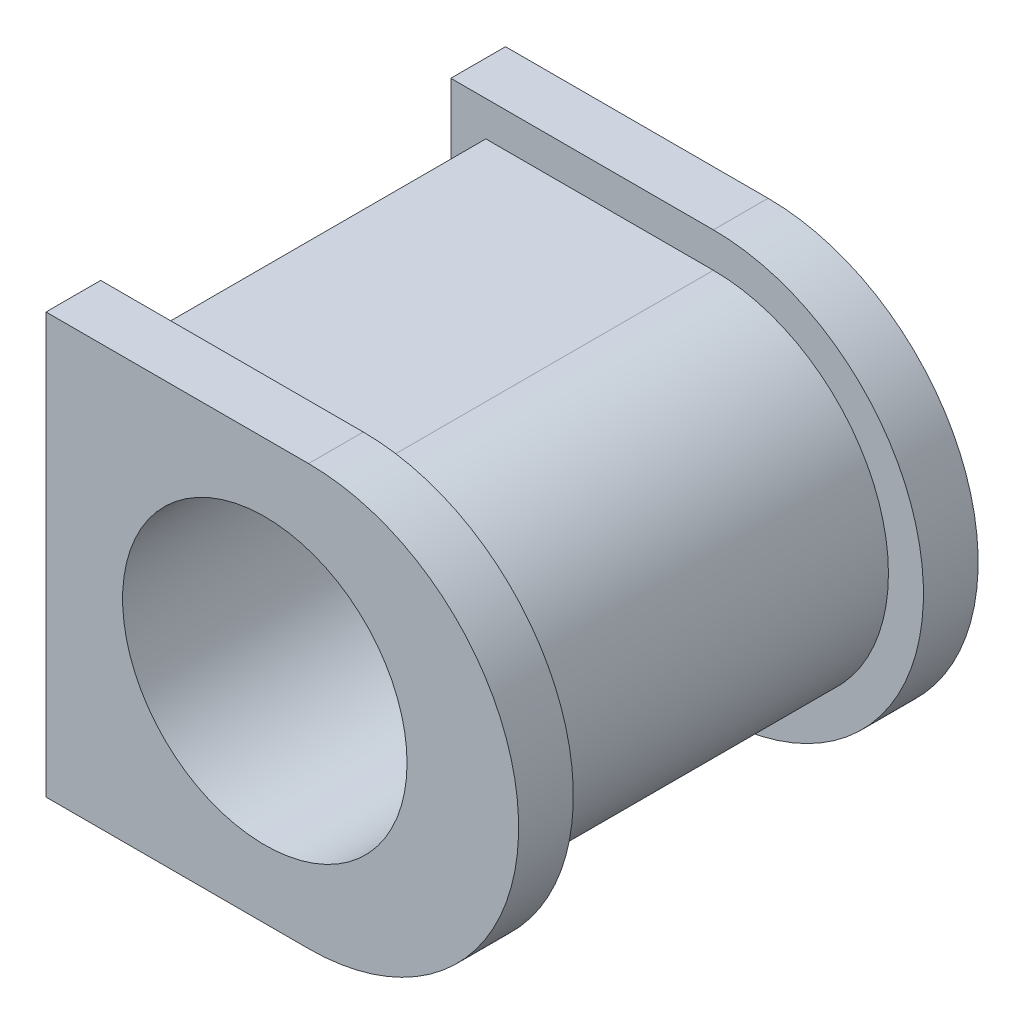
ISO-10303-21;
HEADER;
FILE_DESCRIPTION(('STEP AP214'),'2;1');
FILE_NAME('part.step','',(''),(''),'','','');
FILE_SCHEMA(('AUTOMOTIVE_DESIGN { 1 0 10303 214 1 1 1 1 }'));
ENDSEC;
DATA;
#1=APPLICATION_CONTEXT('core data for automotive mechanical design processes');
#2=APPLICATION_PROTOCOL_DEFINITION('international standard','automotive_design',2000,#1);
#3=PRODUCT_CONTEXT('',#1,'mechanical');
#4=PRODUCT('Part','Part','',(#3));
#5=PRODUCT_RELATED_PRODUCT_CATEGORY('part','',(#4));
#6=PRODUCT_DEFINITION_FORMATION('','',#4);
#7=PRODUCT_DEFINITION_CONTEXT('part definition',#1,'design');
#8=PRODUCT_DEFINITION('design','',#6,#7);
#9=PRODUCT_DEFINITION_SHAPE('','',#8);
#10=(LENGTH_UNIT() NAMED_UNIT(*) SI_UNIT(.MILLI.,.METRE.));
#11=(NAMED_UNIT(*) PLANE_ANGLE_UNIT() SI_UNIT($,.RADIAN.));
#12=(NAMED_UNIT(*) SI_UNIT($,.STERADIAN.) SOLID_ANGLE_UNIT());
#13=UNCERTAINTY_MEASURE_WITH_UNIT(LENGTH_MEASURE(1.E-05),#10,'distance_accuracy_value','');
#14=(GEOMETRIC_REPRESENTATION_CONTEXT(3) GLOBAL_UNCERTAINTY_ASSIGNED_CONTEXT((#13)) GLOBAL_UNIT_ASSIGNED_CONTEXT((#10,
#11,#12)) REPRESENTATION_CONTEXT('',''));
#15=CARTESIAN_POINT('',(0.,0.,0.));
#16=DIRECTION('',(0.,0.,1.));
#17=DIRECTION('',(1.,0.,0.));
#18=AXIS2_PLACEMENT_3D('',#15,#16,#17);
#19=CARTESIAN_POINT('',(26.,0.,40.));
#20=DIRECTION('',(0.,0.,-1.));
#21=DIRECTION('',(-1.,0.,0.));
#22=AXIS2_PLACEMENT_3D('',#19,#20,#21);
#23=CYLINDRICAL_SURFACE('',#22,40.);
#24=CARTESIAN_POINT('',(26.,0.,-40.));
#25=DIRECTION('',(0.,0.,1.));
#26=DIRECTION('',(1.,0.,0.));
#27=AXIS2_PLACEMENT_3D('',#24,#25,#26);
#28=CIRCLE('',#27,40.);
#29=CARTESIAN_POINT('',(26.,-40.,-40.));
#30=VERTEX_POINT('',#29);
#31=CARTESIAN_POINT('',(26.,40.,-40.));
#32=VERTEX_POINT('',#31);
#33=EDGE_CURVE('E199',#30,#32,#28,.T.);
#34=ORIENTED_EDGE('',*,*,#33,.T.);
#35=DIRECTION('',(0.,0.,-1.));
#36=VECTOR('',#35,1.);
#37=CARTESIAN_POINT('',(26.,40.,40.));
#38=LINE('',#37,#36);
#39=CARTESIAN_POINT('',(26.,40.,40.));
#40=VERTEX_POINT('',#39);
#41=EDGE_CURVE('E11',#40,#32,#38,.T.);
#42=ORIENTED_EDGE('',*,*,#41,.F.);
#43=CARTESIAN_POINT('',(26.,0.,40.));
#44=DIRECTION('',(0.,0.,1.));
#45=DIRECTION('',(1.,0.,0.));
#46=AXIS2_PLACEMENT_3D('',#43,#44,#45);
#47=CIRCLE('',#46,40.);
#48=CARTESIAN_POINT('',(26.,-40.,40.));
#49=VERTEX_POINT('',#48);
#50=EDGE_CURVE('E200',#49,#40,#47,.T.);
#51=ORIENTED_EDGE('',*,*,#50,.F.);
#52=DIRECTION('',(0.,0.,-1.));
#53=VECTOR('',#52,1.);
#54=CARTESIAN_POINT('',(26.,-40.,40.));
#55=LINE('',#54,#53);
#56=EDGE_CURVE('E213',#49,#30,#55,.T.);
#57=ORIENTED_EDGE('',*,*,#56,.T.);
#58=EDGE_LOOP('',(#34,#42,#51,#57));
#59=FACE_BOUND('',#58,.T.);
#60=ADVANCED_FACE('F37',(#59),#23,.T.);
#61=CARTESIAN_POINT('',(-26.,40.,40.));
#62=DIRECTION('',(0.,-1.,0.));
#63=DIRECTION('',(0.,0.,-1.));
#64=AXIS2_PLACEMENT_3D('',#61,#62,#63);
#65=PLANE('',#64);
#66=DIRECTION('',(-1.,0.,0.));
#67=VECTOR('',#66,1.);
#68=CARTESIAN_POINT('',(-26.,40.,-40.));
#69=LINE('',#68,#67);
#70=CARTESIAN_POINT('',(-26.,40.,-40.));
#71=VERTEX_POINT('',#70);
#72=EDGE_CURVE('E216',#32,#71,#69,.T.);
#73=ORIENTED_EDGE('',*,*,#72,.T.);
#74=DIRECTION('',(0.,0.,-1.));
#75=VECTOR('',#74,1.);
#76=CARTESIAN_POINT('',(-26.,40.,40.));
#77=LINE('',#76,#75);
#78=CARTESIAN_POINT('',(-26.,40.,40.));
#79=VERTEX_POINT('',#78);
#80=EDGE_CURVE('E45',#79,#71,#77,.T.);
#81=ORIENTED_EDGE('',*,*,#80,.F.);
#82=DIRECTION('',(-1.,0.,0.));
#83=VECTOR('',#82,1.);
#84=CARTESIAN_POINT('',(-26.,40.,40.));
#85=LINE('',#84,#83);
#86=EDGE_CURVE('E203',#40,#79,#85,.T.);
#87=ORIENTED_EDGE('',*,*,#86,.F.);
#88=ORIENTED_EDGE('',*,*,#41,.T.);
#89=EDGE_LOOP('',(#73,#81,#87,#88));
#90=FACE_BOUND('',#89,.T.);
#91=ADVANCED_FACE('F229',(#90),#65,.F.);
#92=CARTESIAN_POINT('',(-26.,-40.,40.));
#93=DIRECTION('',(1.,0.,0.));
#94=DIRECTION('',(0.,0.,-1.));
#95=AXIS2_PLACEMENT_3D('',#92,#93,#94);
#96=PLANE('',#95);
#97=DIRECTION('',(0.,-1.,0.));
#98=VECTOR('',#97,1.);
#99=CARTESIAN_POINT('',(-26.,-40.,-40.));
#100=LINE('',#99,#98);
#101=CARTESIAN_POINT('',(-26.,-40.,-40.));
#102=VERTEX_POINT('',#101);
#103=EDGE_CURVE('E219',#71,#102,#100,.T.);
#104=ORIENTED_EDGE('',*,*,#103,.T.);
#105=DIRECTION('',(0.,0.,-1.));
#106=VECTOR('',#105,1.);
#107=CARTESIAN_POINT('',(-26.,-40.,40.));
#108=LINE('',#107,#106);
#109=CARTESIAN_POINT('',(-26.,-40.,40.));
#110=VERTEX_POINT('',#109);
#111=EDGE_CURVE('E52',#110,#102,#108,.T.);
#112=ORIENTED_EDGE('',*,*,#111,.F.);
#113=DIRECTION('',(0.,-1.,0.));
#114=VECTOR('',#113,1.);
#115=CARTESIAN_POINT('',(-26.,-40.,40.));
#116=LINE('',#115,#114);
#117=EDGE_CURVE('E207',#79,#110,#116,.T.);
#118=ORIENTED_EDGE('',*,*,#117,.F.);
#119=ORIENTED_EDGE('',*,*,#80,.T.);
#120=EDGE_LOOP('',(#104,#112,#118,#119));
#121=FACE_BOUND('',#120,.T.);
#122=ADVANCED_FACE('F226',(#121),#96,.F.);
#123=CARTESIAN_POINT('',(-26.,-40.,40.));
#124=DIRECTION('',(0.,1.,0.));
#125=DIRECTION('',(0.,0.,1.));
#126=AXIS2_PLACEMENT_3D('',#123,#124,#125);
#127=PLANE('',#126);
#128=DIRECTION('',(1.,0.,0.));
#129=VECTOR('',#128,1.);
#130=CARTESIAN_POINT('',(-26.,-40.,-40.));
#131=LINE('',#130,#129);
#132=EDGE_CURVE('E204',#102,#30,#131,.T.);
#133=ORIENTED_EDGE('',*,*,#132,.T.);
#134=ORIENTED_EDGE('',*,*,#56,.F.);
#135=DIRECTION('',(1.,0.,0.));
#136=VECTOR('',#135,1.);
#137=CARTESIAN_POINT('',(-26.,-40.,40.));
#138=LINE('',#137,#136);
#139=EDGE_CURVE('E210',#110,#49,#138,.T.);
#140=ORIENTED_EDGE('',*,*,#139,.F.);
#141=ORIENTED_EDGE('',*,*,#111,.T.);
#142=EDGE_LOOP('',(#133,#134,#140,#141));
#143=FACE_BOUND('',#142,.T.);
#144=ADVANCED_FACE('F236',(#143),#127,.F.);
#145=CARTESIAN_POINT('',(16.,0.,40.));
#146=DIRECTION('',(0.,0.,-1.));
#147=DIRECTION('',(-1.,0.,0.));
#148=AXIS2_PLACEMENT_3D('',#145,#146,#147);
#149=CYLINDRICAL_SURFACE('',#148,32.5);
#150=CARTESIAN_POINT('',(16.,0.,52.5));
#151=DIRECTION('',(0.,0.,1.));
#152=DIRECTION('',(1.,0.,0.));
#153=AXIS2_PLACEMENT_3D('',#150,#151,#152);
#154=CIRCLE('',#153,32.5);
#155=CARTESIAN_POINT('',(48.5,0.,52.5));
#156=VERTEX_POINT('',#155);
#157=EDGE_CURVE('E133',#156,#156,#154,.T.);
#158=ORIENTED_EDGE('',*,*,#157,.T.);
#159=EDGE_LOOP('',(#158));
#160=FACE_BOUND('',#159,.T.);
#161=CARTESIAN_POINT('',(16.,0.,-52.5));
#162=DIRECTION('',(0.,0.,1.));
#163=DIRECTION('',(1.,0.,0.));
#164=AXIS2_PLACEMENT_3D('',#161,#162,#163);
#165=CIRCLE('',#164,32.5);
#166=CARTESIAN_POINT('',(48.5,0.,-52.5));
#167=VERTEX_POINT('',#166);
#168=EDGE_CURVE('E156',#167,#167,#165,.T.);
#169=ORIENTED_EDGE('',*,*,#168,.F.);
#170=EDGE_LOOP('',(#169));
#171=FACE_BOUND('',#170,.T.);
#172=ADVANCED_FACE('F242',(#160,#171),#149,.F.);
#173=CARTESIAN_POINT('',(26.,0.,40.));
#174=DIRECTION('',(0.,0.,1.));
#175=DIRECTION('',(1.,0.,0.));
#176=AXIS2_PLACEMENT_3D('',#173,#174,#175);
#177=PLANE('',#176);
#178=CARTESIAN_POINT('',(26.,0.,40.));
#179=DIRECTION('',(0.,0.,1.));
#180=DIRECTION('',(1.,0.,0.));
#181=AXIS2_PLACEMENT_3D('',#178,#179,#180);
#182=CIRCLE('',#181,48.);
#183=CARTESIAN_POINT('',(26.,-48.,40.));
#184=VERTEX_POINT('',#183);
#185=CARTESIAN_POINT('',(26.,48.,40.));
#186=VERTEX_POINT('',#185);
#187=EDGE_CURVE('E169',#184,#186,#182,.T.);
#188=ORIENTED_EDGE('',*,*,#187,.F.);
#189=DIRECTION('',(1.,0.,0.));
#190=VECTOR('',#189,1.);
#191=CARTESIAN_POINT('',(-34.,-48.,40.));
#192=LINE('',#191,#190);
#193=CARTESIAN_POINT('',(-34.,-48.,40.));
#194=VERTEX_POINT('',#193);
#195=EDGE_CURVE('E174',#194,#184,#192,.T.);
#196=ORIENTED_EDGE('',*,*,#195,.F.);
#197=DIRECTION('',(0.,-1.,0.));
#198=VECTOR('',#197,1.);
#199=CARTESIAN_POINT('',(-34.,48.,40.));
#200=LINE('',#199,#198);
#201=CARTESIAN_POINT('',(-34.,48.,40.));
#202=VERTEX_POINT('',#201);
#203=EDGE_CURVE('E185',#202,#194,#200,.T.);
#204=ORIENTED_EDGE('',*,*,#203,.F.);
#205=DIRECTION('',(-1.,0.,0.));
#206=VECTOR('',#205,1.);
#207=CARTESIAN_POINT('',(26.,48.,40.));
#208=LINE('',#207,#206);
#209=EDGE_CURVE('E183',#186,#202,#208,.T.);
#210=ORIENTED_EDGE('',*,*,#209,.F.);
#211=EDGE_LOOP('',(#188,#196,#204,#210));
#212=FACE_BOUND('',#211,.T.);
#213=ORIENTED_EDGE('',*,*,#139,.T.);
#214=ORIENTED_EDGE('',*,*,#50,.T.);
#215=ORIENTED_EDGE('',*,*,#86,.T.);
#216=ORIENTED_EDGE('',*,*,#117,.T.);
#217=EDGE_LOOP('',(#213,#214,#215,#216));
#218=FACE_BOUND('',#217,.T.);
#219=ADVANCED_FACE('F239',(#212,#218),#177,.F.);
#220=CARTESIAN_POINT('',(26.,0.,52.5));
#221=DIRECTION('',(0.,0.,1.));
#222=DIRECTION('',(1.,0.,0.));
#223=AXIS2_PLACEMENT_3D('',#220,#221,#222);
#224=PLANE('',#223);
#225=CARTESIAN_POINT('',(26.,0.,52.5));
#226=DIRECTION('',(0.,0.,1.));
#227=DIRECTION('',(1.,0.,0.));
#228=AXIS2_PLACEMENT_3D('',#225,#226,#227);
#229=CIRCLE('',#228,48.);
#230=CARTESIAN_POINT('',(26.,-48.,52.5));
#231=VERTEX_POINT('',#230);
#232=CARTESIAN_POINT('',(26.,48.,52.5));
#233=VERTEX_POINT('',#232);
#234=EDGE_CURVE('E170',#231,#233,#229,.T.);
#235=ORIENTED_EDGE('',*,*,#234,.T.);
#236=DIRECTION('',(-1.,0.,0.));
#237=VECTOR('',#236,1.);
#238=CARTESIAN_POINT('',(26.,48.,52.5));
#239=LINE('',#238,#237);
#240=CARTESIAN_POINT('',(-34.,48.,52.5));
#241=VERTEX_POINT('',#240);
#242=EDGE_CURVE('E173',#233,#241,#239,.T.);
#243=ORIENTED_EDGE('',*,*,#242,.T.);
#244=DIRECTION('',(0.,-1.,0.));
#245=VECTOR('',#244,1.);
#246=CARTESIAN_POINT('',(-34.,48.,52.5));
#247=LINE('',#246,#245);
#248=CARTESIAN_POINT('',(-34.,-48.,52.5));
#249=VERTEX_POINT('',#248);
#250=EDGE_CURVE('E176',#241,#249,#247,.T.);
#251=ORIENTED_EDGE('',*,*,#250,.T.);
#252=DIRECTION('',(1.,0.,0.));
#253=VECTOR('',#252,1.);
#254=CARTESIAN_POINT('',(-34.,-48.,52.5));
#255=LINE('',#254,#253);
#256=EDGE_CURVE('E178',#249,#231,#255,.T.);
#257=ORIENTED_EDGE('',*,*,#256,.T.);
#258=EDGE_LOOP('',(#235,#243,#251,#257));
#259=FACE_BOUND('',#258,.T.);
#260=ORIENTED_EDGE('',*,*,#157,.F.);
#261=EDGE_LOOP('',(#260));
#262=FACE_BOUND('',#261,.T.);
#263=ADVANCED_FACE('F241',(#259,#262),#224,.T.);
#264=CARTESIAN_POINT('',(26.,0.,52.5));
#265=DIRECTION('',(0.,0.,-1.));
#266=DIRECTION('',(-1.,0.,0.));
#267=AXIS2_PLACEMENT_3D('',#264,#265,#266);
#268=CYLINDRICAL_SURFACE('',#267,48.);
#269=ORIENTED_EDGE('',*,*,#187,.T.);
#270=DIRECTION('',(0.,0.,-1.));
#271=VECTOR('',#270,1.);
#272=CARTESIAN_POINT('',(26.,48.,52.5));
#273=LINE('',#272,#271);
#274=EDGE_CURVE('E196',#233,#186,#273,.T.);
#275=ORIENTED_EDGE('',*,*,#274,.F.);
#276=ORIENTED_EDGE('',*,*,#234,.F.);
#277=DIRECTION('',(0.,0.,-1.));
#278=VECTOR('',#277,1.);
#279=CARTESIAN_POINT('',(26.,-48.,52.5));
#280=LINE('',#279,#278);
#281=EDGE_CURVE('E180',#231,#184,#280,.T.);
#282=ORIENTED_EDGE('',*,*,#281,.T.);
#283=EDGE_LOOP('',(#269,#275,#276,#282));
#284=FACE_BOUND('',#283,.T.);
#285=ADVANCED_FACE('F249',(#284),#268,.T.);
#286=CARTESIAN_POINT('',(26.,48.,52.5));
#287=DIRECTION('',(0.,-1.,0.));
#288=DIRECTION('',(1.,0.,0.));
#289=AXIS2_PLACEMENT_3D('',#286,#287,#288);
#290=PLANE('',#289);
#291=ORIENTED_EDGE('',*,*,#209,.T.);
#292=DIRECTION('',(0.,0.,-1.));
#293=VECTOR('',#292,1.);
#294=CARTESIAN_POINT('',(-34.,48.,52.5));
#295=LINE('',#294,#293);
#296=EDGE_CURVE('E193',#241,#202,#295,.T.);
#297=ORIENTED_EDGE('',*,*,#296,.F.);
#298=ORIENTED_EDGE('',*,*,#242,.F.);
#299=ORIENTED_EDGE('',*,*,#274,.T.);
#300=EDGE_LOOP('',(#291,#297,#298,#299));
#301=FACE_BOUND('',#300,.T.);
#302=ADVANCED_FACE('F269',(#301),#290,.F.);
#303=CARTESIAN_POINT('',(-34.,48.,52.5));
#304=DIRECTION('',(1.,0.,0.));
#305=DIRECTION('',(0.,0.,-1.));
#306=AXIS2_PLACEMENT_3D('',#303,#304,#305);
#307=PLANE('',#306);
#308=ORIENTED_EDGE('',*,*,#203,.T.);
#309=DIRECTION('',(0.,0.,-1.));
#310=VECTOR('',#309,1.);
#311=CARTESIAN_POINT('',(-34.,-48.,52.5));
#312=LINE('',#311,#310);
#313=EDGE_CURVE('E190',#249,#194,#312,.T.);
#314=ORIENTED_EDGE('',*,*,#313,.F.);
#315=ORIENTED_EDGE('',*,*,#250,.F.);
#316=ORIENTED_EDGE('',*,*,#296,.T.);
#317=EDGE_LOOP('',(#308,#314,#315,#316));
#318=FACE_BOUND('',#317,.T.);
#319=ADVANCED_FACE('F273',(#318),#307,.F.);
#320=CARTESIAN_POINT('',(-34.,-48.,52.5));
#321=DIRECTION('',(0.,1.,0.));
#322=DIRECTION('',(-1.,0.,0.));
#323=AXIS2_PLACEMENT_3D('',#320,#321,#322);
#324=PLANE('',#323);
#325=ORIENTED_EDGE('',*,*,#195,.T.);
#326=ORIENTED_EDGE('',*,*,#281,.F.);
#327=ORIENTED_EDGE('',*,*,#256,.F.);
#328=ORIENTED_EDGE('',*,*,#313,.T.);
#329=EDGE_LOOP('',(#325,#326,#327,#328));
#330=FACE_BOUND('',#329,.T.);
#331=ADVANCED_FACE('F276',(#330),#324,.F.);
#332=CARTESIAN_POINT('',(26.,0.,-52.5));
#333=DIRECTION('',(0.,0.,1.));
#334=DIRECTION('',(1.,0.,0.));
#335=AXIS2_PLACEMENT_3D('',#332,#333,#334);
#336=CYLINDRICAL_SURFACE('',#335,48.);
#337=CARTESIAN_POINT('',(26.,0.,-40.));
#338=DIRECTION('',(0.,0.,1.));
#339=DIRECTION('',(1.,0.,0.));
#340=AXIS2_PLACEMENT_3D('',#337,#338,#339);
#341=CIRCLE('',#340,48.);
#342=CARTESIAN_POINT('',(26.,-48.,-40.));
#343=VERTEX_POINT('',#342);
#344=CARTESIAN_POINT('',(26.,48.,-40.));
#345=VERTEX_POINT('',#344);
#346=EDGE_CURVE('E128',#343,#345,#341,.T.);
#347=ORIENTED_EDGE('',*,*,#346,.F.);
#348=DIRECTION('',(0.,0.,1.));
#349=VECTOR('',#348,1.);
#350=CARTESIAN_POINT('',(26.,-48.,-52.5));
#351=LINE('',#350,#349);
#352=CARTESIAN_POINT('',(26.,-48.,-52.5));
#353=VERTEX_POINT('',#352);
#354=EDGE_CURVE('E122',#353,#343,#351,.T.);
#355=ORIENTED_EDGE('',*,*,#354,.F.);
#356=CARTESIAN_POINT('',(26.,0.,-52.5));
#357=DIRECTION('',(0.,0.,1.));
#358=DIRECTION('',(1.,0.,0.));
#359=AXIS2_PLACEMENT_3D('',#356,#357,#358);
#360=CIRCLE('',#359,48.);
#361=CARTESIAN_POINT('',(26.,48.,-52.5));
#362=VERTEX_POINT('',#361);
#363=EDGE_CURVE('E125',#353,#362,#360,.T.);
#364=ORIENTED_EDGE('',*,*,#363,.T.);
#365=DIRECTION('',(0.,0.,1.));
#366=VECTOR('',#365,1.);
#367=CARTESIAN_POINT('',(26.,48.,-52.5));
#368=LINE('',#367,#366);
#369=EDGE_CURVE('E153',#362,#345,#368,.T.);
#370=ORIENTED_EDGE('',*,*,#369,.T.);
#371=EDGE_LOOP('',(#347,#355,#364,#370));
#372=FACE_BOUND('',#371,.T.);
#373=ADVANCED_FACE('F124',(#372),#336,.T.);
#374=CARTESIAN_POINT('',(-34.,-48.,-52.5));
#375=DIRECTION('',(0.,-1.,0.));
#376=DIRECTION('',(1.,0.,0.));
#377=AXIS2_PLACEMENT_3D('',#374,#375,#376);
#378=PLANE('',#377);
#379=DIRECTION('',(1.,0.,0.));
#380=VECTOR('',#379,1.);
#381=CARTESIAN_POINT('',(-34.,-48.,-40.));
#382=LINE('',#381,#380);
#383=CARTESIAN_POINT('',(-34.,-48.,-40.));
#384=VERTEX_POINT('',#383);
#385=EDGE_CURVE('E155',#384,#343,#382,.T.);
#386=ORIENTED_EDGE('',*,*,#385,.F.);
#387=DIRECTION('',(0.,0.,1.));
#388=VECTOR('',#387,1.);
#389=CARTESIAN_POINT('',(-34.,-48.,-52.5));
#390=LINE('',#389,#388);
#391=CARTESIAN_POINT('',(-34.,-48.,-52.5));
#392=VERTEX_POINT('',#391);
#393=EDGE_CURVE('E134',#392,#384,#390,.T.);
#394=ORIENTED_EDGE('',*,*,#393,.F.);
#395=DIRECTION('',(1.,0.,0.));
#396=VECTOR('',#395,1.);
#397=CARTESIAN_POINT('',(-34.,-48.,-52.5));
#398=LINE('',#397,#396);
#399=EDGE_CURVE('E140',#392,#353,#398,.T.);
#400=ORIENTED_EDGE('',*,*,#399,.T.);
#401=ORIENTED_EDGE('',*,*,#354,.T.);
#402=EDGE_LOOP('',(#386,#394,#400,#401));
#403=FACE_BOUND('',#402,.T.);
#404=ADVANCED_FACE('F146',(#403),#378,.T.);
#405=CARTESIAN_POINT('',(-34.,48.,-52.5));
#406=DIRECTION('',(-1.,0.,0.));
#407=DIRECTION('',(0.,0.,1.));
#408=AXIS2_PLACEMENT_3D('',#405,#406,#407);
#409=PLANE('',#408);
#410=DIRECTION('',(0.,-1.,0.));
#411=VECTOR('',#410,1.);
#412=CARTESIAN_POINT('',(-34.,48.,-40.));
#413=LINE('',#412,#411);
#414=CARTESIAN_POINT('',(-34.,48.,-40.));
#415=VERTEX_POINT('',#414);
#416=EDGE_CURVE('E158',#415,#384,#413,.T.);
#417=ORIENTED_EDGE('',*,*,#416,.F.);
#418=DIRECTION('',(0.,0.,1.));
#419=VECTOR('',#418,1.);
#420=CARTESIAN_POINT('',(-34.,48.,-52.5));
#421=LINE('',#420,#419);
#422=CARTESIAN_POINT('',(-34.,48.,-52.5));
#423=VERTEX_POINT('',#422);
#424=EDGE_CURVE('E164',#423,#415,#421,.T.);
#425=ORIENTED_EDGE('',*,*,#424,.F.);
#426=DIRECTION('',(0.,-1.,0.));
#427=VECTOR('',#426,1.);
#428=CARTESIAN_POINT('',(-34.,48.,-52.5));
#429=LINE('',#428,#427);
#430=EDGE_CURVE('E147',#423,#392,#429,.T.);
#431=ORIENTED_EDGE('',*,*,#430,.T.);
#432=ORIENTED_EDGE('',*,*,#393,.T.);
#433=EDGE_LOOP('',(#417,#425,#431,#432));
#434=FACE_BOUND('',#433,.T.);
#435=ADVANCED_FACE('F307',(#434),#409,.T.);
#436=CARTESIAN_POINT('',(26.,48.,-52.5));
#437=DIRECTION('',(0.,1.,0.));
#438=DIRECTION('',(-1.,0.,0.));
#439=AXIS2_PLACEMENT_3D('',#436,#437,#438);
#440=PLANE('',#439);
#441=DIRECTION('',(-1.,0.,0.));
#442=VECTOR('',#441,1.);
#443=CARTESIAN_POINT('',(26.,48.,-40.));
#444=LINE('',#443,#442);
#445=EDGE_CURVE('E144',#345,#415,#444,.T.);
#446=ORIENTED_EDGE('',*,*,#445,.F.);
#447=ORIENTED_EDGE('',*,*,#369,.F.);
#448=DIRECTION('',(-1.,0.,0.));
#449=VECTOR('',#448,1.);
#450=CARTESIAN_POINT('',(26.,48.,-52.5));
#451=LINE('',#450,#449);
#452=EDGE_CURVE('E143',#362,#423,#451,.T.);
#453=ORIENTED_EDGE('',*,*,#452,.T.);
#454=ORIENTED_EDGE('',*,*,#424,.T.);
#455=EDGE_LOOP('',(#446,#447,#453,#454));
#456=FACE_BOUND('',#455,.T.);
#457=ADVANCED_FACE('F300',(#456),#440,.T.);
#458=CARTESIAN_POINT('',(26.,0.,-52.5));
#459=DIRECTION('',(0.,0.,-1.));
#460=DIRECTION('',(1.,0.,0.));
#461=AXIS2_PLACEMENT_3D('',#458,#459,#460);
#462=PLANE('',#461);
#463=ORIENTED_EDGE('',*,*,#168,.T.);
#464=EDGE_LOOP('',(#463));
#465=FACE_BOUND('',#464,.T.);
#466=ORIENTED_EDGE('',*,*,#363,.F.);
#467=ORIENTED_EDGE('',*,*,#399,.F.);
#468=ORIENTED_EDGE('',*,*,#430,.F.);
#469=ORIENTED_EDGE('',*,*,#452,.F.);
#470=EDGE_LOOP('',(#466,#467,#468,#469));
#471=FACE_BOUND('',#470,.T.);
#472=ADVANCED_FACE('F138',(#465,#471),#462,.T.);
#473=CARTESIAN_POINT('',(26.,0.,-40.));
#474=DIRECTION('',(0.,0.,-1.));
#475=DIRECTION('',(1.,0.,0.));
#476=AXIS2_PLACEMENT_3D('',#473,#474,#475);
#477=PLANE('',#476);
#478=ORIENTED_EDGE('',*,*,#33,.F.);
#479=ORIENTED_EDGE('',*,*,#132,.F.);
#480=ORIENTED_EDGE('',*,*,#103,.F.);
#481=ORIENTED_EDGE('',*,*,#72,.F.);
#482=EDGE_LOOP('',(#478,#479,#480,#481));
#483=FACE_BOUND('',#482,.T.);
#484=ORIENTED_EDGE('',*,*,#346,.T.);
#485=ORIENTED_EDGE('',*,*,#445,.T.);
#486=ORIENTED_EDGE('',*,*,#416,.T.);
#487=ORIENTED_EDGE('',*,*,#385,.T.);
#488=EDGE_LOOP('',(#484,#485,#486,#487));
#489=FACE_BOUND('',#488,.T.);
#490=ADVANCED_FACE('F232',(#483,#489),#477,.F.);
#491=CLOSED_SHELL('',(#60,#91,#122,#144,#172,#219,#263,#285,#302,#319,#331,#373,#404,#435,#457,
#472,#490));
#492=MANIFOLD_SOLID_BREP('B2',#491);
#493=ADVANCED_BREP_SHAPE_REPRESENTATION('',(#18,#492),#14);
#494=SHAPE_DEFINITION_REPRESENTATION(#9,#493);
ENDSEC;
END-ISO-10303-21;
